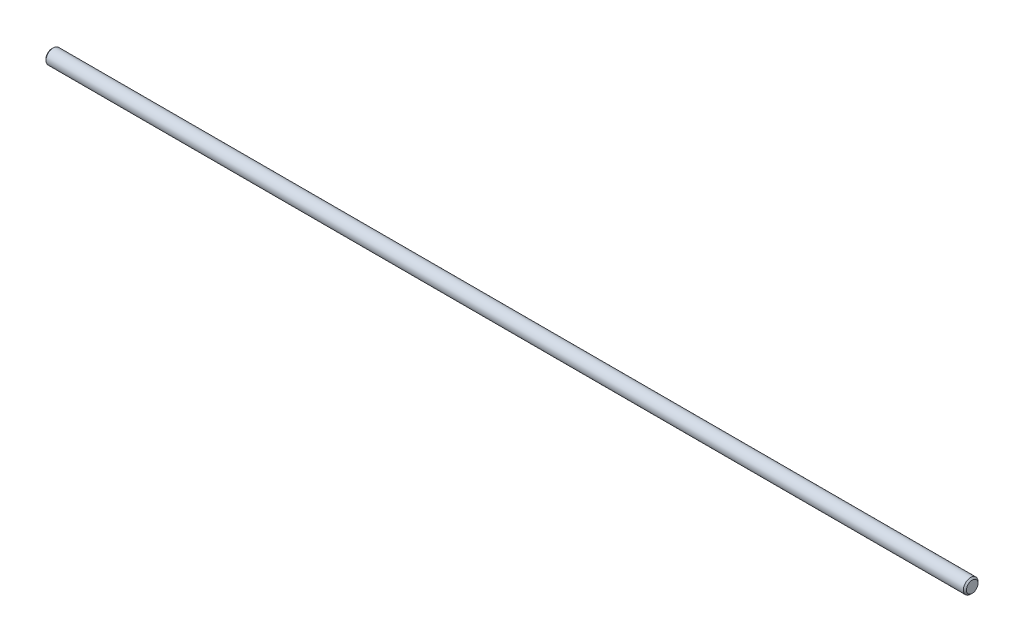
ISO-10303-21;
HEADER;
FILE_DESCRIPTION(('STEP AP214'),'2;1');
FILE_NAME('part.step','',(''),(''),'','','');
FILE_SCHEMA(('AUTOMOTIVE_DESIGN { 1 0 10303 214 1 1 1 1 }'));
ENDSEC;
DATA;
#1=APPLICATION_CONTEXT('core data for automotive mechanical design processes');
#2=APPLICATION_PROTOCOL_DEFINITION('international standard','automotive_design',2000,#1);
#3=PRODUCT_CONTEXT('',#1,'mechanical');
#4=PRODUCT('Part','Part','',(#3));
#5=PRODUCT_RELATED_PRODUCT_CATEGORY('part','',(#4));
#6=PRODUCT_DEFINITION_FORMATION('','',#4);
#7=PRODUCT_DEFINITION_CONTEXT('part definition',#1,'design');
#8=PRODUCT_DEFINITION('design','',#6,#7);
#9=PRODUCT_DEFINITION_SHAPE('','',#8);
#10=(LENGTH_UNIT() NAMED_UNIT(*) SI_UNIT(.MILLI.,.METRE.));
#11=(NAMED_UNIT(*) PLANE_ANGLE_UNIT() SI_UNIT($,.RADIAN.));
#12=(NAMED_UNIT(*) SI_UNIT($,.STERADIAN.) SOLID_ANGLE_UNIT());
#13=UNCERTAINTY_MEASURE_WITH_UNIT(LENGTH_MEASURE(1.E-05),#10,'distance_accuracy_value','');
#14=(GEOMETRIC_REPRESENTATION_CONTEXT(3) GLOBAL_UNCERTAINTY_ASSIGNED_CONTEXT((#13)) GLOBAL_UNIT_ASSIGNED_CONTEXT((#10,
#11,#12)) REPRESENTATION_CONTEXT('',''));
#15=CARTESIAN_POINT('',(0.,0.,0.));
#16=DIRECTION('',(0.,0.,1.));
#17=DIRECTION('',(1.,0.,0.));
#18=AXIS2_PLACEMENT_3D('',#15,#16,#17);
#19=CARTESIAN_POINT('',(300.,0.,0.));
#20=DIRECTION('',(-1.,0.,0.));
#21=DIRECTION('',(0.,0.,1.));
#22=AXIS2_PLACEMENT_3D('',#19,#20,#21);
#23=CYLINDRICAL_SURFACE('',#22,4.7625);
#24=CARTESIAN_POINT('',(299.,0.,0.));
#25=DIRECTION('',(1.,0.,0.));
#26=DIRECTION('',(0.,0.,-1.));
#27=AXIS2_PLACEMENT_3D('',#24,#25,#26);
#28=CIRCLE('',#27,4.7625);
#29=CARTESIAN_POINT('',(299.,0.,-4.7625));
#30=VERTEX_POINT('',#29);
#31=EDGE_CURVE('E38',#30,#30,#28,.F.);
#32=ORIENTED_EDGE('',*,*,#31,.T.);
#33=EDGE_LOOP('',(#32));
#34=FACE_BOUND('',#33,.T.);
#35=CARTESIAN_POINT('',(-299.,0.,0.));
#36=DIRECTION('',(1.,0.,0.));
#37=DIRECTION('',(0.,0.,-1.));
#38=AXIS2_PLACEMENT_3D('',#35,#36,#37);
#39=CIRCLE('',#38,4.7625);
#40=CARTESIAN_POINT('',(-299.,0.,-4.7625));
#41=VERTEX_POINT('',#40);
#42=EDGE_CURVE('E42',#41,#41,#39,.T.);
#43=ORIENTED_EDGE('',*,*,#42,.T.);
#44=EDGE_LOOP('',(#43));
#45=FACE_BOUND('',#44,.T.);
#46=ADVANCED_FACE('F31',(#34,#45),#23,.T.);
#47=CARTESIAN_POINT('',(300.,0.,0.));
#48=DIRECTION('',(1.,0.,0.));
#49=DIRECTION('',(0.,0.,-1.));
#50=AXIS2_PLACEMENT_3D('',#47,#48,#49);
#51=PLANE('',#50);
#52=CARTESIAN_POINT('',(300.,0.,0.));
#53=DIRECTION('',(1.,0.,0.));
#54=DIRECTION('',(0.,0.,-1.));
#55=AXIS2_PLACEMENT_3D('',#52,#53,#54);
#56=CIRCLE('',#55,3.76250000000011);
#57=CARTESIAN_POINT('',(300.,0.,-3.76250000000011));
#58=VERTEX_POINT('',#57);
#59=EDGE_CURVE('E46',#58,#58,#56,.T.);
#60=ORIENTED_EDGE('',*,*,#59,.T.);
#61=EDGE_LOOP('',(#60));
#62=FACE_BOUND('',#61,.T.);
#63=ADVANCED_FACE('F52',(#62),#51,.T.);
#64=CARTESIAN_POINT('',(-300.,0.,0.));
#65=DIRECTION('',(1.,0.,0.));
#66=DIRECTION('',(0.,0.,-1.));
#67=AXIS2_PLACEMENT_3D('',#64,#65,#66);
#68=PLANE('',#67);
#69=CARTESIAN_POINT('',(-300.,0.,0.));
#70=DIRECTION('',(1.,0.,0.));
#71=DIRECTION('',(0.,0.,-1.));
#72=AXIS2_PLACEMENT_3D('',#69,#70,#71);
#73=CIRCLE('',#72,3.7625);
#74=CARTESIAN_POINT('',(-300.,0.,-3.7625));
#75=VERTEX_POINT('',#74);
#76=EDGE_CURVE('E10',#75,#75,#73,.F.);
#77=ORIENTED_EDGE('',*,*,#76,.T.);
#78=EDGE_LOOP('',(#77));
#79=FACE_BOUND('',#78,.T.);
#80=ADVANCED_FACE('F56',(#79),#68,.F.);
#81=CARTESIAN_POINT('',(300.,0.,0.));
#82=DIRECTION('',(-1.,0.,0.));
#83=DIRECTION('',(0.,0.,1.));
#84=AXIS2_PLACEMENT_3D('',#81,#82,#83);
#85=CONICAL_SURFACE('',#84,3.76250000000011,0.785398163397447);
#86=ORIENTED_EDGE('',*,*,#31,.F.);
#87=EDGE_LOOP('',(#86));
#88=FACE_BOUND('',#87,.T.);
#89=ORIENTED_EDGE('',*,*,#59,.F.);
#90=EDGE_LOOP('',(#89));
#91=FACE_BOUND('',#90,.T.);
#92=ADVANCED_FACE('F54',(#88,#91),#85,.T.);
#93=CARTESIAN_POINT('',(-299.,0.,0.));
#94=DIRECTION('',(1.,0.,0.));
#95=DIRECTION('',(0.,0.,-1.));
#96=AXIS2_PLACEMENT_3D('',#93,#94,#95);
#97=CONICAL_SURFACE('',#96,4.7625,0.785398163397447);
#98=ORIENTED_EDGE('',*,*,#76,.F.);
#99=EDGE_LOOP('',(#98));
#100=FACE_BOUND('',#99,.T.);
#101=ORIENTED_EDGE('',*,*,#42,.F.);
#102=EDGE_LOOP('',(#101));
#103=FACE_BOUND('',#102,.T.);
#104=ADVANCED_FACE('F33',(#100,#103),#97,.T.);
#105=CLOSED_SHELL('',(#46,#63,#80,#92,#104));
#106=MANIFOLD_SOLID_BREP('B2',#105);
#107=ADVANCED_BREP_SHAPE_REPRESENTATION('',(#18,#106),#14);
#108=SHAPE_DEFINITION_REPRESENTATION(#9,#107);
ENDSEC;
END-ISO-10303-21;
